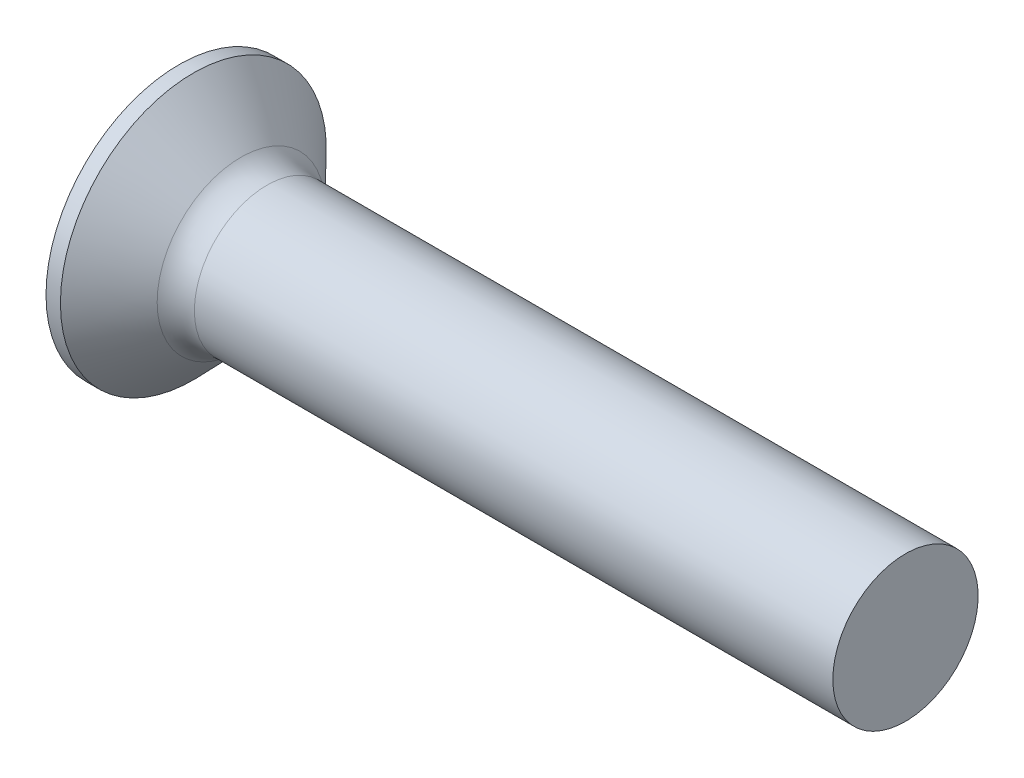
ISO-10303-21;
HEADER;
FILE_DESCRIPTION(('STEP AP214'),'2;1');
FILE_NAME('part.step','',(''),(''),'','','');
FILE_SCHEMA(('AUTOMOTIVE_DESIGN { 1 0 10303 214 1 1 1 1 }'));
ENDSEC;
DATA;
#1=APPLICATION_CONTEXT('core data for automotive mechanical design processes');
#2=APPLICATION_PROTOCOL_DEFINITION('international standard','automotive_design',2000,#1);
#3=PRODUCT_CONTEXT('',#1,'mechanical');
#4=PRODUCT('Part','Part','',(#3));
#5=PRODUCT_RELATED_PRODUCT_CATEGORY('part','',(#4));
#6=PRODUCT_DEFINITION_FORMATION('','',#4);
#7=PRODUCT_DEFINITION_CONTEXT('part definition',#1,'design');
#8=PRODUCT_DEFINITION('design','',#6,#7);
#9=PRODUCT_DEFINITION_SHAPE('','',#8);
#10=(LENGTH_UNIT() NAMED_UNIT(*) SI_UNIT(.MILLI.,.METRE.));
#11=(NAMED_UNIT(*) PLANE_ANGLE_UNIT() SI_UNIT($,.RADIAN.));
#12=(NAMED_UNIT(*) SI_UNIT($,.STERADIAN.) SOLID_ANGLE_UNIT());
#13=UNCERTAINTY_MEASURE_WITH_UNIT(LENGTH_MEASURE(1.E-05),#10,'distance_accuracy_value','');
#14=(GEOMETRIC_REPRESENTATION_CONTEXT(3) GLOBAL_UNCERTAINTY_ASSIGNED_CONTEXT((#13)) GLOBAL_UNIT_ASSIGNED_CONTEXT((#10,
#11,#12)) REPRESENTATION_CONTEXT('',''));
#15=CARTESIAN_POINT('',(0.,0.,0.));
#16=DIRECTION('',(0.,0.,1.));
#17=DIRECTION('',(1.,0.,0.));
#18=AXIS2_PLACEMENT_3D('',#15,#16,#17);
#19=CARTESIAN_POINT('',(0.,0.,0.));
#20=DIRECTION('',(-1.,0.,0.));
#21=DIRECTION('',(0.,0.,1.));
#22=AXIS2_PLACEMENT_3D('',#19,#20,#21);
#23=PLANE('',#22);
#24=CARTESIAN_POINT('',(0.,0.,0.));
#25=DIRECTION('',(-1.,0.,0.));
#26=DIRECTION('',(0.,0.,1.));
#27=AXIS2_PLACEMENT_3D('',#24,#25,#26);
#28=CIRCLE('',#27,9.15);
#29=CARTESIAN_POINT('',(0.,0.,9.15));
#30=VERTEX_POINT('',#29);
#31=EDGE_CURVE('E325',#30,#30,#28,.T.);
#32=ORIENTED_EDGE('',*,*,#31,.T.);
#33=EDGE_LOOP('',(#32));
#34=FACE_BOUND('',#33,.T.);
#35=DIRECTION('',(0.,0.,-1.));
#36=VECTOR('',#35,1.);
#37=CARTESIAN_POINT('',(0.,-1.08000000000002,4.9));
#38=LINE('',#37,#36);
#39=CARTESIAN_POINT('',(0.,-1.08000000000002,4.9));
#40=VERTEX_POINT('',#39);
#41=CARTESIAN_POINT('',(0.,-1.08000000000001,2.05881047761803));
#42=VERTEX_POINT('',#41);
#43=EDGE_CURVE('E346',#40,#42,#38,.T.);
#44=ORIENTED_EDGE('',*,*,#43,.T.);
#45=CARTESIAN_POINT('',(0.,0.,0.));
#46=DIRECTION('',(-1.,0.,0.));
#47=DIRECTION('',(0.,0.,1.));
#48=AXIS2_PLACEMENT_3D('',#45,#46,#47);
#49=CIRCLE('',#48,2.32488721936136);
#50=CARTESIAN_POINT('',(0.,-2.05881047761803,1.08));
#51=VERTEX_POINT('',#50);
#52=EDGE_CURVE('E418',#51,#42,#49,.T.);
#53=ORIENTED_EDGE('',*,*,#52,.F.);
#54=DIRECTION('',(0.,-1.,0.));
#55=VECTOR('',#54,1.);
#56=CARTESIAN_POINT('',(0.,4.9,1.08));
#57=LINE('',#56,#55);
#58=CARTESIAN_POINT('',(0.,-4.9,1.08));
#59=VERTEX_POINT('',#58);
#60=EDGE_CURVE('E297',#51,#59,#57,.T.);
#61=ORIENTED_EDGE('',*,*,#60,.T.);
#62=DIRECTION('',(0.,0.,-1.));
#63=VECTOR('',#62,1.);
#64=CARTESIAN_POINT('',(0.,-4.9,1.08));
#65=LINE('',#64,#63);
#66=CARTESIAN_POINT('',(0.,-4.9,-1.08));
#67=VERTEX_POINT('',#66);
#68=EDGE_CURVE('E280',#59,#67,#65,.T.);
#69=ORIENTED_EDGE('',*,*,#68,.T.);
#70=DIRECTION('',(0.,1.,0.));
#71=VECTOR('',#70,1.);
#72=CARTESIAN_POINT('',(0.,-4.9,-1.08));
#73=LINE('',#72,#71);
#74=CARTESIAN_POINT('',(0.,-2.05881047761803,-1.08));
#75=VERTEX_POINT('',#74);
#76=EDGE_CURVE('E289',#67,#75,#73,.T.);
#77=ORIENTED_EDGE('',*,*,#76,.T.);
#78=CARTESIAN_POINT('',(0.,-1.07999999999999,-2.05881047761803));
#79=VERTEX_POINT('',#78);
#80=EDGE_CURVE('E403',#79,#75,#49,.T.);
#81=ORIENTED_EDGE('',*,*,#80,.F.);
#82=CARTESIAN_POINT('',(0.,-1.07999999999998,-4.9));
#83=VERTEX_POINT('',#82);
#84=EDGE_CURVE('E350',#79,#83,#38,.T.);
#85=ORIENTED_EDGE('',*,*,#84,.T.);
#86=DIRECTION('',(0.,1.,0.));
#87=VECTOR('',#86,1.);
#88=CARTESIAN_POINT('',(0.,-1.07999999999998,-4.9));
#89=LINE('',#88,#87);
#90=CARTESIAN_POINT('',(0.,1.08000000000002,-4.9));
#91=VERTEX_POINT('',#90);
#92=EDGE_CURVE('E339',#83,#91,#89,.T.);
#93=ORIENTED_EDGE('',*,*,#92,.T.);
#94=DIRECTION('',(0.,0.,1.));
#95=VECTOR('',#94,1.);
#96=CARTESIAN_POINT('',(0.,1.08000000000002,-4.9));
#97=LINE('',#96,#95);
#98=CARTESIAN_POINT('',(0.,1.08000000000001,-2.05881047761803));
#99=VERTEX_POINT('',#98);
#100=EDGE_CURVE('E354',#91,#99,#97,.T.);
#101=ORIENTED_EDGE('',*,*,#100,.T.);
#102=CARTESIAN_POINT('',(0.,2.05881047761803,-1.08));
#103=VERTEX_POINT('',#102);
#104=EDGE_CURVE('E416',#103,#99,#49,.T.);
#105=ORIENTED_EDGE('',*,*,#104,.F.);
#106=CARTESIAN_POINT('',(0.,4.9,-1.08));
#107=VERTEX_POINT('',#106);
#108=EDGE_CURVE('E292',#103,#107,#73,.T.);
#109=ORIENTED_EDGE('',*,*,#108,.T.);
#110=DIRECTION('',(0.,0.,1.));
#111=VECTOR('',#110,1.);
#112=CARTESIAN_POINT('',(0.,4.9,-1.08));
#113=LINE('',#112,#111);
#114=CARTESIAN_POINT('',(0.,4.9,1.08));
#115=VERTEX_POINT('',#114);
#116=EDGE_CURVE('E291',#107,#115,#113,.T.);
#117=ORIENTED_EDGE('',*,*,#116,.T.);
#118=CARTESIAN_POINT('',(0.,2.05881047761803,1.08));
#119=VERTEX_POINT('',#118);
#120=EDGE_CURVE('E299',#115,#119,#57,.T.);
#121=ORIENTED_EDGE('',*,*,#120,.T.);
#122=CARTESIAN_POINT('',(0.,1.07999999999999,2.05881047761803));
#123=VERTEX_POINT('',#122);
#124=EDGE_CURVE('E417',#123,#119,#49,.T.);
#125=ORIENTED_EDGE('',*,*,#124,.F.);
#126=CARTESIAN_POINT('',(0.,1.07999999999998,4.9));
#127=VERTEX_POINT('',#126);
#128=EDGE_CURVE('E357',#123,#127,#97,.T.);
#129=ORIENTED_EDGE('',*,*,#128,.T.);
#130=DIRECTION('',(0.,-1.,0.));
#131=VECTOR('',#130,1.);
#132=CARTESIAN_POINT('',(0.,1.07999999999998,4.9));
#133=LINE('',#132,#131);
#134=EDGE_CURVE('E356',#127,#40,#133,.T.);
#135=ORIENTED_EDGE('',*,*,#134,.T.);
#136=EDGE_LOOP('',(#44,#53,#61,#69,#77,#81,#85,#93,#101,#105,#109,#117,#121,#125,#129,#135));
#137=FACE_BOUND('',#136,.T.);
#138=ADVANCED_FACE('F34',(#34,#137),#23,.T.);
#139=CARTESIAN_POINT('',(5.64,-2.08799982760698,1.08));
#140=DIRECTION('',(0.,0.,-1.));
#141=DIRECTION('',(0.,1.,0.));
#142=AXIS2_PLACEMENT_3D('',#139,#140,#141);
#143=PLANE('',#142);
#144=ORIENTED_EDGE('',*,*,#60,.F.);
#145=CARTESIAN_POINT('',(-3.508552371452,-2.33231165002222,1.08));
#146=CARTESIAN_POINT('',(-2.80212427855351,-2.27786290347494,1.08));
#147=CARTESIAN_POINT('',(-2.09572000083794,-2.22310096882498,1.08));
#148=CARTESIAN_POINT('',(-0.682963739884882,-2.11273813340588,1.08));
#149=CARTESIAN_POINT('',(0.0233882421280163,-2.05713721697088,1.08));
#150=CARTESIAN_POINT('',(1.08285390271521,-1.97294867301992,1.08));
#151=CARTESIAN_POINT('',(1.43599884659094,-1.94475462132179,1.08));
#152=CARTESIAN_POINT('',(2.14226366201043,-1.88806550876942,1.08));
#153=CARTESIAN_POINT('',(2.49538353361693,-1.8595704486972,1.08));
#154=CARTESIAN_POINT('',(3.2015889523463,-1.8022365024152,1.08));
#155=CARTESIAN_POINT('',(3.55467449997447,-1.77339762243347,1.08));
#156=CARTESIAN_POINT('',(4.26081605784269,-1.71532132056914,1.08));
#157=CARTESIAN_POINT('',(4.61387206778542,-1.68608389507013,1.08));
#158=CARTESIAN_POINT('',(5.41612732471709,-1.61911650604659,1.08));
#159=CARTESIAN_POINT('',(5.86531460668917,-1.58124295320442,1.08));
#160=CARTESIAN_POINT('',(6.76360881538388,-1.50456871786306,1.08));
#161=CARTESIAN_POINT('',(7.21271574234448,-1.46576803815681,1.08));
#162=CARTESIAN_POINT('',(8.11080846678724,-1.38699687421515,1.08));
#163=CARTESIAN_POINT('',(8.55979426851682,-1.34702643850978,1.08));
#164=CARTESIAN_POINT('',(9.45763439362018,-1.26556606443146,1.08));
#165=CARTESIAN_POINT('',(9.90648871523721,-1.22407610661242,1.08));
#166=CARTESIAN_POINT('',(10.804086472022,-1.13904091064148,1.08));
#167=CARTESIAN_POINT('',(11.2528298716191,-1.09549529593565,1.08));
#168=CARTESIAN_POINT('',(12.1500162616112,-1.00552937785306,1.08));
#169=CARTESIAN_POINT('',(12.5984592620319,-0.959109175798602,1.08));
#170=CARTESIAN_POINT('',(13.2708059653168,-0.8861578155995,1.08));
#171=CARTESIAN_POINT('',(13.4948891256712,-0.861284749868426,1.08));
#172=CARTESIAN_POINT('',(13.9428873803505,-0.810096676380916,1.08));
#173=CARTESIAN_POINT('',(14.1668024775431,-0.783781693824128,1.08));
#174=CARTESIAN_POINT('',(14.6144284155526,-0.729227223623336,1.08));
#175=CARTESIAN_POINT('',(14.8381392281789,-0.700987502036455,1.08));
#176=CARTESIAN_POINT('',(15.1734409779729,-0.656575769482209,1.08));
#177=CARTESIAN_POINT('',(15.2851674140663,-0.641429360520812,1.08));
#178=CARTESIAN_POINT('',(15.5085023247459,-0.610277030221325,1.08));
#179=CARTESIAN_POINT('',(15.6201107970542,-0.594271092583297,1.08));
#180=CARTESIAN_POINT('',(15.731644359719,-0.577747837441695,1.08));
#181=B_SPLINE_CURVE_WITH_KNOTS('',3,(#145,#146,#147,#148,#149,#150,#151,#152,#153,#154,#155,
#156,#157,#158,#159,#160,#161,#162,#163,#164,#165,#166,#167,#168,#169,#170,#171,#172,#173,#174,
#175,#176,#177,#178,#179,#180),.UNSPECIFIED.,.F.,.F.,(4,2,2,2,2,2,2,2,2,2,2,2,2,2,2,2,2,4),(0.,
2.12557045381571,4.25118064652266,5.31398639952898,6.37678939206669,7.4395731618212,
8.50236658170693,9.85470917308545,11.2070476910761,12.559330183477,13.9116299877686,
15.2641784740572,16.6166793133679,17.2930539423714,17.9694167544874,18.6458619223979,
18.984104295463,19.3223530851586),.UNSPECIFIED.);
#182=CARTESIAN_POINT('',(5.64,-1.60013444747621,1.08));
#183=VERTEX_POINT('',#182);
#184=EDGE_CURVE('E394',#51,#183,#181,.T.);
#185=ORIENTED_EDGE('',*,*,#184,.T.);
#186=DIRECTION('',(0.,-1.,0.));
#187=VECTOR('',#186,1.);
#188=CARTESIAN_POINT('',(5.64,2.08799982760698,1.08));
#189=LINE('',#188,#187);
#190=CARTESIAN_POINT('',(5.64,-2.08799982760698,1.08));
#191=VERTEX_POINT('',#190);
#192=EDGE_CURVE('E315',#183,#191,#189,.T.);
#193=ORIENTED_EDGE('',*,*,#192,.T.);
#194=DIRECTION('',(0.89493436774996,0.446197800778958,0.));
#195=VECTOR('',#194,1.);
#196=CARTESIAN_POINT('',(0.,-4.9,1.08));
#197=LINE('',#196,#195);
#198=EDGE_CURVE('E286',#59,#191,#197,.T.);
#199=ORIENTED_EDGE('',*,*,#198,.F.);
#200=EDGE_LOOP('',(#144,#185,#193,#199));
#201=FACE_BOUND('',#200,.T.);
#202=ADVANCED_FACE('F166',(#201),#143,.T.);
#203=CARTESIAN_POINT('',(5.64,2.08799982760699,1.08));
#204=VERTEX_POINT('',#203);
#205=CARTESIAN_POINT('',(5.64,1.60013444747621,1.08));
#206=VERTEX_POINT('',#205);
#207=EDGE_CURVE('E317',#204,#206,#189,.T.);
#208=ORIENTED_EDGE('',*,*,#207,.T.);
#209=CARTESIAN_POINT('',(-3.508552371452,2.33231165002222,1.08));
#210=CARTESIAN_POINT('',(-2.8021242785535,2.27786290347494,1.08));
#211=CARTESIAN_POINT('',(-2.09572000083793,2.22310096882498,1.08));
#212=CARTESIAN_POINT('',(-0.682963739884882,2.11273813340588,1.08));
#213=CARTESIAN_POINT('',(0.0233882421280164,2.05713721697088,1.08));
#214=CARTESIAN_POINT('',(1.08285390271521,1.97294867301993,1.08));
#215=CARTESIAN_POINT('',(1.43599884659094,1.94475462132179,1.08));
#216=CARTESIAN_POINT('',(2.14226366201043,1.88806550876942,1.08));
#217=CARTESIAN_POINT('',(2.49538353361693,1.8595704486972,1.08));
#218=CARTESIAN_POINT('',(3.2015889523463,1.8022365024152,1.08));
#219=CARTESIAN_POINT('',(3.55467449997447,1.77339762243347,1.08));
#220=CARTESIAN_POINT('',(4.26081605784269,1.71532132056914,1.08));
#221=CARTESIAN_POINT('',(4.61387206778542,1.68608389507013,1.08));
#222=CARTESIAN_POINT('',(5.41612732471709,1.61911650604659,1.08));
#223=CARTESIAN_POINT('',(5.86531460668916,1.58124295320442,1.08));
#224=CARTESIAN_POINT('',(6.76360881538388,1.50456871786306,1.08));
#225=CARTESIAN_POINT('',(7.21271574234448,1.46576803815681,1.08));
#226=CARTESIAN_POINT('',(8.11080846678724,1.38699687421515,1.08));
#227=CARTESIAN_POINT('',(8.55979426851681,1.34702643850978,1.08));
#228=CARTESIAN_POINT('',(9.45763439362018,1.26556606443146,1.08));
#229=CARTESIAN_POINT('',(9.90648871523721,1.22407610661242,1.08));
#230=CARTESIAN_POINT('',(10.804086472022,1.13904091064148,1.08));
#231=CARTESIAN_POINT('',(11.2528298716191,1.09549529593565,1.08));
#232=CARTESIAN_POINT('',(12.1500162616112,1.00552937785306,1.08));
#233=CARTESIAN_POINT('',(12.5984592620319,0.959109175798603,1.08));
#234=CARTESIAN_POINT('',(13.2708059653168,0.886157815599501,1.08));
#235=CARTESIAN_POINT('',(13.4948891256712,0.861284749868425,1.08));
#236=CARTESIAN_POINT('',(13.9428873803505,0.810096676380916,1.08));
#237=CARTESIAN_POINT('',(14.1668024775431,0.783781693824127,1.08));
#238=CARTESIAN_POINT('',(14.6144284155526,0.729227223623335,1.08));
#239=CARTESIAN_POINT('',(14.8381392281789,0.700987502036455,1.08));
#240=CARTESIAN_POINT('',(15.1734409779729,0.656575769482208,1.08));
#241=CARTESIAN_POINT('',(15.2851674140663,0.641429360520811,1.08));
#242=CARTESIAN_POINT('',(15.5085023247459,0.610277030221324,1.08));
#243=CARTESIAN_POINT('',(15.6201107970543,0.594271092583296,1.08));
#244=CARTESIAN_POINT('',(15.731644359719,0.577747837441694,1.08));
#245=B_SPLINE_CURVE_WITH_KNOTS('',3,(#209,#210,#211,#212,#213,#214,#215,#216,#217,#218,#219,
#220,#221,#222,#223,#224,#225,#226,#227,#228,#229,#230,#231,#232,#233,#234,#235,#236,#237,#238,
#239,#240,#241,#242,#243,#244),.UNSPECIFIED.,.F.,.F.,(4,2,2,2,2,2,2,2,2,2,2,2,2,2,2,2,2,4),(0.,
2.12557045381571,4.25118064652265,5.31398639952898,6.37678939206668,7.43957316182119,
8.50236658170693,9.85470917308544,11.2070476910761,12.559330183477,13.9116299877686,
15.2641784740572,16.6166793133679,17.2930539423714,17.9694167544874,18.6458619223979,
18.984104295463,19.3223530851586),.UNSPECIFIED.);
#246=EDGE_CURVE('E226',#206,#119,#245,.F.);
#247=ORIENTED_EDGE('',*,*,#246,.T.);
#248=ORIENTED_EDGE('',*,*,#120,.F.);
#249=DIRECTION('',(0.89493436774996,-0.446197800778958,0.));
#250=VECTOR('',#249,1.);
#251=CARTESIAN_POINT('',(0.,4.9,1.08));
#252=LINE('',#251,#250);
#253=EDGE_CURVE('E62',#115,#204,#252,.T.);
#254=ORIENTED_EDGE('',*,*,#253,.T.);
#255=EDGE_LOOP('',(#208,#247,#248,#254));
#256=FACE_BOUND('',#255,.T.);
#257=ADVANCED_FACE('F171',(#256),#143,.T.);
#258=CARTESIAN_POINT('',(5.64,2.08799982760699,-1.08));
#259=DIRECTION('',(0.,0.,1.));
#260=DIRECTION('',(1.,0.,0.));
#261=AXIS2_PLACEMENT_3D('',#258,#259,#260);
#262=PLANE('',#261);
#263=DIRECTION('',(0.,1.,0.));
#264=VECTOR('',#263,1.);
#265=CARTESIAN_POINT('',(5.64,-2.08799982760699,-1.08));
#266=LINE('',#265,#264);
#267=CARTESIAN_POINT('',(5.64,-2.08799982760699,-1.08));
#268=VERTEX_POINT('',#267);
#269=CARTESIAN_POINT('',(5.64,-1.60013444747621,-1.08));
#270=VERTEX_POINT('',#269);
#271=EDGE_CURVE('E316',#268,#270,#266,.T.);
#272=ORIENTED_EDGE('',*,*,#271,.T.);
#273=CARTESIAN_POINT('',(-3.50855235785895,-2.33231164897474,-1.08));
#274=CARTESIAN_POINT('',(-2.80212426669874,-2.27786290255719,-1.08));
#275=CARTESIAN_POINT('',(-2.09571999072138,-2.22310096803798,-1.08));
#276=CARTESIAN_POINT('',(-0.682963733244686,-2.11273813288378,-1.08));
#277=CARTESIAN_POINT('',(0.0233882470300694,-2.05713721658294,-1.08));
#278=CARTESIAN_POINT('',(1.0828539044558,-1.97294867288082,-1.08));
#279=CARTESIAN_POINT('',(1.43599884690811,-1.94475462129601,-1.08));
#280=CARTESIAN_POINT('',(2.14226365948097,-1.88806550897276,-1.08));
#281=CARTESIAN_POINT('',(2.49538352966426,-1.85957044901634,-1.08));
#282=CARTESIAN_POINT('',(3.20158894554756,-1.80223650296893,-1.08));
#283=CARTESIAN_POINT('',(3.55467449175288,-1.773397623106,-1.08));
#284=CARTESIAN_POINT('',(4.26081604677565,-1.715321321483,-1.08));
#285=CARTESIAN_POINT('',(4.61387205529579,-1.68608389610653,-1.08));
#286=CARTESIAN_POINT('',(5.41612731080518,-1.61911650721572,-1.08));
#287=CARTESIAN_POINT('',(5.86531459277744,-1.58124295438217,-1.08));
#288=CARTESIAN_POINT('',(6.76360880147276,-1.50456871906015,-1.08));
#289=CARTESIAN_POINT('',(7.21271572843377,-1.46576803936464,-1.08));
#290=CARTESIAN_POINT('',(8.11080845287784,-1.38699687544741,-1.08));
#291=CARTESIAN_POINT('',(8.55979425460832,-1.34702643975574,-1.08));
#292=CARTESIAN_POINT('',(9.45763437971387,-1.26556606570916,-1.08));
#293=CARTESIAN_POINT('',(9.90648870133217,-1.22407610790816,-1.08));
#294=CARTESIAN_POINT('',(10.8040864581195,-1.13904091198014,-1.08));
#295=CARTESIAN_POINT('',(11.2528298577178,-1.09549529729918,-1.08));
#296=CARTESIAN_POINT('',(12.1500162477138,-1.00552937927742,-1.08));
#297=CARTESIAN_POINT('',(12.5984592481373,-0.959109177258918,-1.08));
#298=CARTESIAN_POINT('',(13.2708059514278,-0.886157817129851,-1.08));
#299=CARTESIAN_POINT('',(13.4948891117843,-0.861284751424836,-1.08));
#300=CARTESIAN_POINT('',(13.9428873664685,-0.810096677997513,-1.08));
#301=CARTESIAN_POINT('',(14.1668024636642,-0.783781695474851,-1.08));
#302=CARTESIAN_POINT('',(14.6144284016815,-0.729227225354873,-1.08));
#303=CARTESIAN_POINT('',(14.8381392143124,-0.700987503814685,-1.08));
#304=CARTESIAN_POINT('',(15.1734409641157,-0.65657577134678,-1.08));
#305=CARTESIAN_POINT('',(15.2851674002126,-0.64142936241689,-1.08));
#306=CARTESIAN_POINT('',(15.5085023109007,-0.610277032188298,-1.08));
#307=CARTESIAN_POINT('',(15.6201107832138,-0.594271094589659,-1.08));
#308=CARTESIAN_POINT('',(15.7316443458843,-0.577747839492605,-1.08));
#309=B_SPLINE_CURVE_WITH_KNOTS('',3,(#273,#274,#275,#276,#277,#278,#279,#280,#281,#282,#283,
#284,#285,#286,#287,#288,#289,#290,#291,#292,#293,#294,#295,#296,#297,#298,#299,#300,#301,#302,
#303,#304,#305,#306,#307,#308),.UNSPECIFIED.,.F.,.F.,(4,2,2,2,2,2,2,2,2,2,2,2,2,2,2,2,2,4),(0.,
2.12557044858637,4.25118063606338,5.31398638478592,6.3767893730399,7.439573138511,
8.50236655411318,9.85470914549009,11.2070476634792,12.5593301558792,13.9116299601696,
15.2641784464547,16.6166792857626,17.2930539147632,17.9694167268767,18.6458618947835,
18.9841042678463,19.3223530575396),.UNSPECIFIED.);
#310=EDGE_CURVE('E220',#270,#75,#309,.F.);
#311=ORIENTED_EDGE('',*,*,#310,.T.);
#312=ORIENTED_EDGE('',*,*,#76,.F.);
#313=DIRECTION('',(0.89493436774996,0.446197800778958,0.));
#314=VECTOR('',#313,1.);
#315=CARTESIAN_POINT('',(0.,-4.9,-1.08));
#316=LINE('',#315,#314);
#317=EDGE_CURVE('E276',#67,#268,#316,.T.);
#318=ORIENTED_EDGE('',*,*,#317,.T.);
#319=EDGE_LOOP('',(#272,#311,#312,#318));
#320=FACE_BOUND('',#319,.T.);
#321=ADVANCED_FACE('F206',(#320),#262,.T.);
#322=ORIENTED_EDGE('',*,*,#108,.F.);
#323=CARTESIAN_POINT('',(-3.50855235785895,2.33231164897474,-1.08));
#324=CARTESIAN_POINT('',(-2.80212426669874,2.27786290255719,-1.08));
#325=CARTESIAN_POINT('',(-2.09571999072138,2.22310096803798,-1.08));
#326=CARTESIAN_POINT('',(-0.682963733244686,2.11273813288378,-1.08));
#327=CARTESIAN_POINT('',(0.0233882470300688,2.05713721658294,-1.08));
#328=CARTESIAN_POINT('',(1.0828539044558,1.97294867288082,-1.08));
#329=CARTESIAN_POINT('',(1.43599884690811,1.94475462129601,-1.08));
#330=CARTESIAN_POINT('',(2.14226365948097,1.88806550897276,-1.08));
#331=CARTESIAN_POINT('',(2.49538352966426,1.85957044901634,-1.08));
#332=CARTESIAN_POINT('',(3.20158894554756,1.80223650296893,-1.08));
#333=CARTESIAN_POINT('',(3.55467449175288,1.773397623106,-1.08));
#334=CARTESIAN_POINT('',(4.26081604677565,1.715321321483,-1.08));
#335=CARTESIAN_POINT('',(4.61387205529579,1.68608389610653,-1.08));
#336=CARTESIAN_POINT('',(5.41612731080518,1.61911650721572,-1.08));
#337=CARTESIAN_POINT('',(5.86531459277744,1.58124295438217,-1.08));
#338=CARTESIAN_POINT('',(6.76360880147275,1.50456871906015,-1.08));
#339=CARTESIAN_POINT('',(7.21271572843377,1.46576803936464,-1.08));
#340=CARTESIAN_POINT('',(8.11080845287784,1.38699687544741,-1.08));
#341=CARTESIAN_POINT('',(8.55979425460832,1.34702643975574,-1.08));
#342=CARTESIAN_POINT('',(9.45763437971387,1.26556606570916,-1.08));
#343=CARTESIAN_POINT('',(9.90648870133217,1.22407610790816,-1.08));
#344=CARTESIAN_POINT('',(10.8040864581195,1.13904091198014,-1.08));
#345=CARTESIAN_POINT('',(11.2528298577178,1.09549529729918,-1.08));
#346=CARTESIAN_POINT('',(12.1500162477138,1.00552937927742,-1.08));
#347=CARTESIAN_POINT('',(12.5984592481373,0.959109177258918,-1.08));
#348=CARTESIAN_POINT('',(13.2708059514278,0.886157817129851,-1.08));
#349=CARTESIAN_POINT('',(13.4948891117843,0.861284751424836,-1.08));
#350=CARTESIAN_POINT('',(13.9428873664685,0.810096677997514,-1.08));
#351=CARTESIAN_POINT('',(14.1668024636642,0.783781695474852,-1.08));
#352=CARTESIAN_POINT('',(14.6144284016814,0.729227225354874,-1.08));
#353=CARTESIAN_POINT('',(14.8381392143124,0.700987503814685,-1.08));
#354=CARTESIAN_POINT('',(15.1734409641157,0.656575771346781,-1.08));
#355=CARTESIAN_POINT('',(15.2851674002126,0.641429362416891,-1.08));
#356=CARTESIAN_POINT('',(15.5085023109006,0.610277032188299,-1.08));
#357=CARTESIAN_POINT('',(15.6201107832138,0.59427109458966,-1.08));
#358=CARTESIAN_POINT('',(15.7316443458843,0.577747839492606,-1.08));
#359=B_SPLINE_CURVE_WITH_KNOTS('',3,(#323,#324,#325,#326,#327,#328,#329,#330,#331,#332,#333,
#334,#335,#336,#337,#338,#339,#340,#341,#342,#343,#344,#345,#346,#347,#348,#349,#350,#351,#352,
#353,#354,#355,#356,#357,#358),.UNSPECIFIED.,.F.,.F.,(4,2,2,2,2,2,2,2,2,2,2,2,2,2,2,2,2,4),(0.,
2.12557044858637,4.25118063606338,5.31398638478592,6.3767893730399,7.439573138511,
8.50236655411318,9.85470914549009,11.2070476634792,12.5593301558792,13.9116299601696,
15.2641784464547,16.6166792857626,17.2930539147632,17.9694167268767,18.6458618947834,
18.9841042678463,19.3223530575396),.UNSPECIFIED.);
#360=CARTESIAN_POINT('',(5.64,1.60013444747621,-1.08));
#361=VERTEX_POINT('',#360);
#362=EDGE_CURVE('E214',#103,#361,#359,.T.);
#363=ORIENTED_EDGE('',*,*,#362,.T.);
#364=CARTESIAN_POINT('',(5.64,2.08799982760698,-1.08));
#365=VERTEX_POINT('',#364);
#366=EDGE_CURVE('E321',#361,#365,#266,.T.);
#367=ORIENTED_EDGE('',*,*,#366,.T.);
#368=DIRECTION('',(0.89493436774996,-0.446197800778958,0.));
#369=VECTOR('',#368,1.);
#370=CARTESIAN_POINT('',(0.,4.9,-1.08));
#371=LINE('',#370,#369);
#372=EDGE_CURVE('E310',#107,#365,#371,.T.);
#373=ORIENTED_EDGE('',*,*,#372,.F.);
#374=EDGE_LOOP('',(#322,#363,#367,#373));
#375=FACE_BOUND('',#374,.T.);
#376=ADVANCED_FACE('F198',(#375),#262,.T.);
#377=CARTESIAN_POINT('',(5.64,2.08799982760698,-1.08));
#378=DIRECTION('',(1.,0.,0.));
#379=DIRECTION('',(0.,0.,-1.));
#380=AXIS2_PLACEMENT_3D('',#377,#378,#379);
#381=PLANE('',#380);
#382=CARTESIAN_POINT('',(5.64,0.,0.));
#383=DIRECTION('',(-1.,0.,0.));
#384=DIRECTION('',(0.,0.,1.));
#385=AXIS2_PLACEMENT_3D('',#382,#383,#384);
#386=CIRCLE('',#385,1.9305);
#387=EDGE_CURVE('E425',#270,#183,#386,.T.);
#388=ORIENTED_EDGE('',*,*,#387,.F.);
#389=ORIENTED_EDGE('',*,*,#271,.F.);
#390=DIRECTION('',(0.,0.,-1.));
#391=VECTOR('',#390,1.);
#392=CARTESIAN_POINT('',(5.64,-2.08799982760698,1.08));
#393=LINE('',#392,#391);
#394=EDGE_CURVE('E283',#191,#268,#393,.T.);
#395=ORIENTED_EDGE('',*,*,#394,.F.);
#396=ORIENTED_EDGE('',*,*,#192,.F.);
#397=EDGE_LOOP('',(#388,#389,#395,#396));
#398=FACE_BOUND('',#397,.T.);
#399=ADVANCED_FACE('F194',(#398),#381,.F.);
#400=CARTESIAN_POINT('',(5.64,-1.08000000000001,1.60013444747621));
#401=VERTEX_POINT('',#400);
#402=CARTESIAN_POINT('',(5.64,1.07999999999999,1.60013444747622));
#403=VERTEX_POINT('',#402);
#404=EDGE_CURVE('E420',#401,#403,#386,.T.);
#405=ORIENTED_EDGE('',*,*,#404,.F.);
#406=DIRECTION('',(0.,0.,-1.));
#407=VECTOR('',#406,1.);
#408=CARTESIAN_POINT('',(5.64,-1.08000000000001,2.08799982760698));
#409=LINE('',#408,#407);
#410=CARTESIAN_POINT('',(5.64,-1.08000000000001,2.08799982760698));
#411=VERTEX_POINT('',#410);
#412=EDGE_CURVE('E375',#411,#401,#409,.T.);
#413=ORIENTED_EDGE('',*,*,#412,.F.);
#414=DIRECTION('',(0.,-1.,0.));
#415=VECTOR('',#414,1.);
#416=CARTESIAN_POINT('',(5.64,1.07999999999999,2.08799982760699));
#417=LINE('',#416,#415);
#418=CARTESIAN_POINT('',(5.64,1.07999999999999,2.08799982760699));
#419=VERTEX_POINT('',#418);
#420=EDGE_CURVE('E370',#419,#411,#417,.T.);
#421=ORIENTED_EDGE('',*,*,#420,.F.);
#422=DIRECTION('',(0.,0.,1.));
#423=VECTOR('',#422,1.);
#424=CARTESIAN_POINT('',(5.64,1.08000000000001,-2.08799982760698));
#425=LINE('',#424,#423);
#426=EDGE_CURVE('E380',#403,#419,#425,.T.);
#427=ORIENTED_EDGE('',*,*,#426,.F.);
#428=EDGE_LOOP('',(#405,#413,#421,#427));
#429=FACE_BOUND('',#428,.T.);
#430=ADVANCED_FACE('F197',(#429),#381,.F.);
#431=EDGE_CURVE('E391',#206,#361,#386,.T.);
#432=ORIENTED_EDGE('',*,*,#431,.F.);
#433=ORIENTED_EDGE('',*,*,#207,.F.);
#434=DIRECTION('',(0.,0.,1.));
#435=VECTOR('',#434,1.);
#436=CARTESIAN_POINT('',(5.64,2.08799982760698,-1.08));
#437=LINE('',#436,#435);
#438=EDGE_CURVE('E313',#365,#204,#437,.T.);
#439=ORIENTED_EDGE('',*,*,#438,.F.);
#440=ORIENTED_EDGE('',*,*,#366,.F.);
#441=EDGE_LOOP('',(#432,#433,#439,#440));
#442=FACE_BOUND('',#441,.T.);
#443=ADVANCED_FACE('F388',(#442),#381,.F.);
#444=CARTESIAN_POINT('',(5.64,1.08000000000001,-1.60013444747621));
#445=VERTEX_POINT('',#444);
#446=CARTESIAN_POINT('',(5.64,-1.07999999999999,-1.60013444747621));
#447=VERTEX_POINT('',#446);
#448=EDGE_CURVE('E415',#445,#447,#386,.T.);
#449=ORIENTED_EDGE('',*,*,#448,.F.);
#450=CARTESIAN_POINT('',(5.64,1.08000000000001,-2.08799982760698));
#451=VERTEX_POINT('',#450);
#452=EDGE_CURVE('E374',#451,#445,#425,.T.);
#453=ORIENTED_EDGE('',*,*,#452,.F.);
#454=DIRECTION('',(0.,1.,0.));
#455=VECTOR('',#454,1.);
#456=CARTESIAN_POINT('',(5.64,-1.07999999999999,-2.08799982760699));
#457=LINE('',#456,#455);
#458=CARTESIAN_POINT('',(5.64,-1.07999999999999,-2.08799982760699));
#459=VERTEX_POINT('',#458);
#460=EDGE_CURVE('E369',#459,#451,#457,.T.);
#461=ORIENTED_EDGE('',*,*,#460,.F.);
#462=EDGE_CURVE('E373',#447,#459,#409,.T.);
#463=ORIENTED_EDGE('',*,*,#462,.F.);
#464=EDGE_LOOP('',(#449,#453,#461,#463));
#465=FACE_BOUND('',#464,.T.);
#466=ADVANCED_FACE('F200',(#465),#381,.F.);
#467=CARTESIAN_POINT('',(5.64,1.07999999999999,2.08799982760699));
#468=DIRECTION('',(0.,-1.,0.));
#469=DIRECTION('',(1.,0.,0.));
#470=AXIS2_PLACEMENT_3D('',#467,#468,#469);
#471=PLANE('',#470);
#472=ORIENTED_EDGE('',*,*,#452,.T.);
#473=CARTESIAN_POINT('',(-3.508552371452,1.08000000000001,-2.33231165002222));
#474=CARTESIAN_POINT('',(-2.8021242785535,1.08000000000001,-2.27786290347493));
#475=CARTESIAN_POINT('',(-2.09572000083794,1.08000000000001,-2.22310096882497));
#476=CARTESIAN_POINT('',(-0.682963739884883,1.08000000000001,-2.11273813340588));
#477=CARTESIAN_POINT('',(0.023388242128016,1.08000000000001,-2.05713721697088));
#478=CARTESIAN_POINT('',(1.08285390271521,1.08000000000001,-1.97294867301992));
#479=CARTESIAN_POINT('',(1.43599884659094,1.08000000000001,-1.94475462132178));
#480=CARTESIAN_POINT('',(2.14226366201044,1.08000000000001,-1.88806550876941));
#481=CARTESIAN_POINT('',(2.49538353361694,1.08000000000001,-1.8595704486972));
#482=CARTESIAN_POINT('',(3.2015889523463,1.08000000000001,-1.8022365024152));
#483=CARTESIAN_POINT('',(3.55467449997447,1.08000000000001,-1.77339762243347));
#484=CARTESIAN_POINT('',(4.26081605784269,1.08000000000001,-1.71532132056914));
#485=CARTESIAN_POINT('',(4.61387206778542,1.08000000000001,-1.68608389507012));
#486=CARTESIAN_POINT('',(5.41612732471709,1.08000000000001,-1.61911650604659));
#487=CARTESIAN_POINT('',(5.86531460668917,1.08000000000001,-1.58124295320442));
#488=CARTESIAN_POINT('',(6.76360881538388,1.08,-1.50456871786305));
#489=CARTESIAN_POINT('',(7.21271574234448,1.08,-1.46576803815681));
#490=CARTESIAN_POINT('',(8.11080846678724,1.08,-1.38699687421514));
#491=CARTESIAN_POINT('',(8.55979426851682,1.08,-1.34702643850977));
#492=CARTESIAN_POINT('',(9.45763439362018,1.08,-1.26556606443146));
#493=CARTESIAN_POINT('',(9.90648871523721,1.08,-1.22407610661242));
#494=CARTESIAN_POINT('',(10.804086472022,1.08,-1.13904091064148));
#495=CARTESIAN_POINT('',(11.2528298716191,1.08,-1.09549529593564));
#496=CARTESIAN_POINT('',(12.1500162616112,1.08,-1.00552937785305));
#497=CARTESIAN_POINT('',(12.5984592620319,1.08,-0.959109175798599));
#498=CARTESIAN_POINT('',(13.2708059653168,1.08,-0.886157815599496));
#499=CARTESIAN_POINT('',(13.4948891256712,1.08,-0.861284749868422));
#500=CARTESIAN_POINT('',(13.9428873803505,1.08,-0.810096676380912));
#501=CARTESIAN_POINT('',(14.1668024775431,1.08,-0.783781693824124));
#502=CARTESIAN_POINT('',(14.6144284155526,1.08,-0.729227223623332));
#503=CARTESIAN_POINT('',(14.8381392281789,1.08,-0.700987502036451));
#504=CARTESIAN_POINT('',(15.1734409779729,1.08,-0.656575769482205));
#505=CARTESIAN_POINT('',(15.2851674140663,1.08,-0.641429360520808));
#506=CARTESIAN_POINT('',(15.5085023247459,1.08,-0.61027703022132));
#507=CARTESIAN_POINT('',(15.6201107970542,1.08,-0.594271092583292));
#508=CARTESIAN_POINT('',(15.731644359719,1.08,-0.577747837441691));
#509=B_SPLINE_CURVE_WITH_KNOTS('',3,(#473,#474,#475,#476,#477,#478,#479,#480,#481,#482,#483,
#484,#485,#486,#487,#488,#489,#490,#491,#492,#493,#494,#495,#496,#497,#498,#499,#500,#501,#502,
#503,#504,#505,#506,#507,#508),.UNSPECIFIED.,.F.,.F.,(4,2,2,2,2,2,2,2,2,2,2,2,2,2,2,2,2,4),(0.,
2.12557045381571,4.25118064652266,5.31398639952898,6.37678939206669,7.4395731618212,
8.50236658170693,9.85470917308545,11.2070476910761,12.559330183477,13.9116299877686,
15.2641784740572,16.6166793133679,17.2930539423714,17.9694167544874,18.6458619223979,
18.984104295463,19.3223530851586),.UNSPECIFIED.);
#510=EDGE_CURVE('E251',#445,#99,#509,.F.);
#511=ORIENTED_EDGE('',*,*,#510,.T.);
#512=ORIENTED_EDGE('',*,*,#100,.F.);
#513=DIRECTION('',(0.89493436774996,0.,0.446197800778958));
#514=VECTOR('',#513,1.);
#515=CARTESIAN_POINT('',(0.,1.08000000000002,-4.9));
#516=LINE('',#515,#514);
#517=EDGE_CURVE('E361',#91,#451,#516,.T.);
#518=ORIENTED_EDGE('',*,*,#517,.T.);
#519=EDGE_LOOP('',(#472,#511,#512,#518));
#520=FACE_BOUND('',#519,.T.);
#521=ADVANCED_FACE('F257',(#520),#471,.T.);
#522=CARTESIAN_POINT('',(5.64,-1.07999999999999,-2.08799982760699));
#523=DIRECTION('',(0.,1.,0.));
#524=DIRECTION('',(0.,0.,1.));
#525=AXIS2_PLACEMENT_3D('',#522,#523,#524);
#526=PLANE('',#525);
#527=ORIENTED_EDGE('',*,*,#84,.F.);
#528=CARTESIAN_POINT('',(-3.508552371452,-1.07999999999999,-2.33231165002223));
#529=CARTESIAN_POINT('',(-2.8021242785535,-1.07999999999999,-2.27786290347494));
#530=CARTESIAN_POINT('',(-2.09572000083793,-1.07999999999999,-2.22310096882498));
#531=CARTESIAN_POINT('',(-0.682963739884882,-1.07999999999999,-2.11273813340588));
#532=CARTESIAN_POINT('',(0.0233882421280161,-1.07999999999999,-2.05713721697089));
#533=CARTESIAN_POINT('',(1.08285390271521,-1.07999999999999,-1.97294867301993));
#534=CARTESIAN_POINT('',(1.43599884659094,-1.07999999999999,-1.94475462132179));
#535=CARTESIAN_POINT('',(2.14226366201043,-1.07999999999999,-1.88806550876942));
#536=CARTESIAN_POINT('',(2.49538353361693,-1.07999999999999,-1.85957044869721));
#537=CARTESIAN_POINT('',(3.2015889523463,-1.07999999999999,-1.80223650241521));
#538=CARTESIAN_POINT('',(3.55467449997447,-1.07999999999999,-1.77339762243348));
#539=CARTESIAN_POINT('',(4.26081605784269,-1.07999999999999,-1.71532132056914));
#540=CARTESIAN_POINT('',(4.61387206778542,-1.07999999999999,-1.68608389507013));
#541=CARTESIAN_POINT('',(5.41612732471709,-1.07999999999999,-1.6191165060466));
#542=CARTESIAN_POINT('',(5.86531460668916,-1.07999999999999,-1.58124295320443));
#543=CARTESIAN_POINT('',(6.76360881538388,-1.07999999999999,-1.50456871786306));
#544=CARTESIAN_POINT('',(7.21271574234448,-1.07999999999999,-1.46576803815681));
#545=CARTESIAN_POINT('',(8.11080846678724,-1.08,-1.38699687421515));
#546=CARTESIAN_POINT('',(8.55979426851681,-1.08,-1.34702643850978));
#547=CARTESIAN_POINT('',(9.45763439362018,-1.08,-1.26556606443146));
#548=CARTESIAN_POINT('',(9.90648871523721,-1.08,-1.22407610661242));
#549=CARTESIAN_POINT('',(10.804086472022,-1.08,-1.13904091064149));
#550=CARTESIAN_POINT('',(11.2528298716191,-1.08,-1.09549529593565));
#551=CARTESIAN_POINT('',(12.1500162616112,-1.08,-1.00552937785306));
#552=CARTESIAN_POINT('',(12.5984592620319,-1.08,-0.959109175798606));
#553=CARTESIAN_POINT('',(13.2708059653168,-1.08,-0.886157815599504));
#554=CARTESIAN_POINT('',(13.4948891256712,-1.08,-0.861284749868429));
#555=CARTESIAN_POINT('',(13.9428873803505,-1.08,-0.81009667638092));
#556=CARTESIAN_POINT('',(14.1668024775431,-1.08,-0.783781693824131));
#557=CARTESIAN_POINT('',(14.6144284155526,-1.08,-0.729227223623339));
#558=CARTESIAN_POINT('',(14.8381392281789,-1.08,-0.700987502036459));
#559=CARTESIAN_POINT('',(15.1734409779729,-1.08,-0.656575769482213));
#560=CARTESIAN_POINT('',(15.2851674140663,-1.08,-0.641429360520816));
#561=CARTESIAN_POINT('',(15.5085023247459,-1.08,-0.610277030221329));
#562=CARTESIAN_POINT('',(15.6201107970542,-1.08,-0.594271092583301));
#563=CARTESIAN_POINT('',(15.731644359719,-1.08,-0.577747837441699));
#564=B_SPLINE_CURVE_WITH_KNOTS('',3,(#528,#529,#530,#531,#532,#533,#534,#535,#536,#537,#538,
#539,#540,#541,#542,#543,#544,#545,#546,#547,#548,#549,#550,#551,#552,#553,#554,#555,#556,#557,
#558,#559,#560,#561,#562,#563),.UNSPECIFIED.,.F.,.F.,(4,2,2,2,2,2,2,2,2,2,2,2,2,2,2,2,2,4),(0.,
2.12557045381571,4.25118064652266,5.31398639952898,6.37678939206669,7.43957316182119,
8.50236658170693,9.85470917308544,11.2070476910761,12.559330183477,13.9116299877686,
15.2641784740572,16.6166793133679,17.2930539423714,17.9694167544874,18.6458619223979,
18.984104295463,19.3223530851586),.UNSPECIFIED.);
#565=EDGE_CURVE('E246',#79,#447,#564,.T.);
#566=ORIENTED_EDGE('',*,*,#565,.T.);
#567=ORIENTED_EDGE('',*,*,#462,.T.);
#568=DIRECTION('',(0.89493436774996,0.,0.446197800778958));
#569=VECTOR('',#568,1.);
#570=CARTESIAN_POINT('',(0.,-1.07999999999998,-4.9));
#571=LINE('',#570,#569);
#572=EDGE_CURVE('E358',#83,#459,#571,.T.);
#573=ORIENTED_EDGE('',*,*,#572,.F.);
#574=EDGE_LOOP('',(#527,#566,#567,#573));
#575=FACE_BOUND('',#574,.T.);
#576=ADVANCED_FACE('F261',(#575),#526,.T.);
#577=ORIENTED_EDGE('',*,*,#412,.T.);
#578=CARTESIAN_POINT('',(-3.50855235785895,-1.08000000000001,2.33231164897474));
#579=CARTESIAN_POINT('',(-2.80212426669874,-1.08000000000001,2.27786290255719));
#580=CARTESIAN_POINT('',(-2.09571999072138,-1.08000000000001,2.22310096803797));
#581=CARTESIAN_POINT('',(-0.682963733244687,-1.08000000000001,2.11273813288378));
#582=CARTESIAN_POINT('',(0.0233882470300683,-1.08000000000001,2.05713721658293));
#583=CARTESIAN_POINT('',(1.0828539044558,-1.08000000000001,1.97294867288082));
#584=CARTESIAN_POINT('',(1.43599884690811,-1.08000000000001,1.94475462129601));
#585=CARTESIAN_POINT('',(2.14226365948097,-1.08000000000001,1.88806550897276));
#586=CARTESIAN_POINT('',(2.49538352966426,-1.08000000000001,1.85957044901634));
#587=CARTESIAN_POINT('',(3.20158894554756,-1.08000000000001,1.80223650296892));
#588=CARTESIAN_POINT('',(3.55467449175288,-1.08000000000001,1.77339762310599));
#589=CARTESIAN_POINT('',(4.26081604677565,-1.08000000000001,1.715321321483));
#590=CARTESIAN_POINT('',(4.61387205529579,-1.08000000000001,1.68608389610653));
#591=CARTESIAN_POINT('',(5.41612731080518,-1.08000000000001,1.61911650721572));
#592=CARTESIAN_POINT('',(5.86531459277744,-1.08000000000001,1.58124295438216));
#593=CARTESIAN_POINT('',(6.76360880147275,-1.08,1.50456871906015));
#594=CARTESIAN_POINT('',(7.21271572843377,-1.08,1.46576803936464));
#595=CARTESIAN_POINT('',(8.11080845287784,-1.08,1.38699687544741));
#596=CARTESIAN_POINT('',(8.55979425460832,-1.08,1.34702643975574));
#597=CARTESIAN_POINT('',(9.45763437971387,-1.08,1.26556606570916));
#598=CARTESIAN_POINT('',(9.90648870133217,-1.08,1.22407610790816));
#599=CARTESIAN_POINT('',(10.8040864581195,-1.08,1.13904091198014));
#600=CARTESIAN_POINT('',(11.2528298577178,-1.08,1.09549529729918));
#601=CARTESIAN_POINT('',(12.1500162477138,-1.08,1.00552937927742));
#602=CARTESIAN_POINT('',(12.5984592481373,-1.08,0.959109177258916));
#603=CARTESIAN_POINT('',(13.2708059514278,-1.08,0.886157817129848));
#604=CARTESIAN_POINT('',(13.4948891117843,-1.08,0.861284751424833));
#605=CARTESIAN_POINT('',(13.9428873664685,-1.08,0.81009667799751));
#606=CARTESIAN_POINT('',(14.1668024636642,-1.08,0.783781695474849));
#607=CARTESIAN_POINT('',(14.6144284016814,-1.08,0.729227225354871));
#608=CARTESIAN_POINT('',(14.8381392143124,-1.08,0.700987503814682));
#609=CARTESIAN_POINT('',(15.1734409641157,-1.08,0.656575771346778));
#610=CARTESIAN_POINT('',(15.2851674002126,-1.08,0.641429362416888));
#611=CARTESIAN_POINT('',(15.5085023109006,-1.08,0.610277032188297));
#612=CARTESIAN_POINT('',(15.6201107832138,-1.08,0.594271094589657));
#613=CARTESIAN_POINT('',(15.7316443458843,-1.08,0.577747839492603));
#614=B_SPLINE_CURVE_WITH_KNOTS('',3,(#578,#579,#580,#581,#582,#583,#584,#585,#586,#587,#588,
#589,#590,#591,#592,#593,#594,#595,#596,#597,#598,#599,#600,#601,#602,#603,#604,#605,#606,#607,
#608,#609,#610,#611,#612,#613),.UNSPECIFIED.,.F.,.F.,(4,2,2,2,2,2,2,2,2,2,2,2,2,2,2,2,2,4),(0.,
2.12557044858637,4.25118063606338,5.31398638478592,6.3767893730399,7.439573138511,
8.50236655411318,9.85470914549009,11.2070476634792,12.5593301558792,13.9116299601696,
15.2641784464547,16.6166792857626,17.2930539147632,17.9694167268767,18.6458618947834,
18.9841042678463,19.3223530575396),.UNSPECIFIED.);
#615=EDGE_CURVE('E239',#401,#42,#614,.F.);
#616=ORIENTED_EDGE('',*,*,#615,.T.);
#617=ORIENTED_EDGE('',*,*,#43,.F.);
#618=DIRECTION('',(0.89493436774996,0.,-0.446197800778958));
#619=VECTOR('',#618,1.);
#620=CARTESIAN_POINT('',(0.,-1.08000000000002,4.9));
#621=LINE('',#620,#619);
#622=EDGE_CURVE('E364',#40,#411,#621,.T.);
#623=ORIENTED_EDGE('',*,*,#622,.T.);
#624=EDGE_LOOP('',(#577,#616,#617,#623));
#625=FACE_BOUND('',#624,.T.);
#626=ADVANCED_FACE('F444',(#625),#526,.T.);
#627=ORIENTED_EDGE('',*,*,#128,.F.);
#628=CARTESIAN_POINT('',(-3.508552371452,1.07999999999999,2.33231165002223));
#629=CARTESIAN_POINT('',(-2.8021242785535,1.07999999999999,2.27786290347494));
#630=CARTESIAN_POINT('',(-2.09572000083793,1.07999999999999,2.22310096882498));
#631=CARTESIAN_POINT('',(-0.682963739884882,1.07999999999999,2.11273813340588));
#632=CARTESIAN_POINT('',(0.0233882421280168,1.07999999999999,2.05713721697089));
#633=CARTESIAN_POINT('',(1.08285390271521,1.07999999999999,1.97294867301993));
#634=CARTESIAN_POINT('',(1.43599884659094,1.07999999999999,1.94475462132179));
#635=CARTESIAN_POINT('',(2.14226366201044,1.07999999999999,1.88806550876942));
#636=CARTESIAN_POINT('',(2.49538353361694,1.07999999999999,1.85957044869721));
#637=CARTESIAN_POINT('',(3.2015889523463,1.07999999999999,1.80223650241521));
#638=CARTESIAN_POINT('',(3.55467449997447,1.07999999999999,1.77339762243348));
#639=CARTESIAN_POINT('',(4.26081605784269,1.07999999999999,1.71532132056914));
#640=CARTESIAN_POINT('',(4.61387206778542,1.07999999999999,1.68608389507013));
#641=CARTESIAN_POINT('',(5.41612732471709,1.07999999999999,1.6191165060466));
#642=CARTESIAN_POINT('',(5.86531460668917,1.07999999999999,1.58124295320443));
#643=CARTESIAN_POINT('',(6.76360881538388,1.07999999999999,1.50456871786306));
#644=CARTESIAN_POINT('',(7.21271574234448,1.07999999999999,1.46576803815681));
#645=CARTESIAN_POINT('',(8.11080846678724,1.07999999999999,1.38699687421515));
#646=CARTESIAN_POINT('',(8.55979426851682,1.07999999999999,1.34702643850978));
#647=CARTESIAN_POINT('',(9.45763439362019,1.08,1.26556606443146));
#648=CARTESIAN_POINT('',(9.90648871523721,1.08,1.22407610661242));
#649=CARTESIAN_POINT('',(10.804086472022,1.08,1.13904091064149));
#650=CARTESIAN_POINT('',(11.2528298716191,1.08,1.09549529593565));
#651=CARTESIAN_POINT('',(12.1500162616112,1.08,1.00552937785306));
#652=CARTESIAN_POINT('',(12.5984592620319,1.08,0.959109175798606));
#653=CARTESIAN_POINT('',(13.2708059653168,1.08,0.886157815599504));
#654=CARTESIAN_POINT('',(13.4948891256712,1.08,0.861284749868429));
#655=CARTESIAN_POINT('',(13.9428873803505,1.08,0.810096676380919));
#656=CARTESIAN_POINT('',(14.1668024775431,1.08,0.783781693824131));
#657=CARTESIAN_POINT('',(14.6144284155526,1.08,0.729227223623339));
#658=CARTESIAN_POINT('',(14.8381392281789,1.08,0.700987502036458));
#659=CARTESIAN_POINT('',(15.1734409779729,1.08,0.656575769482212));
#660=CARTESIAN_POINT('',(15.2851674140663,1.08,0.641429360520814));
#661=CARTESIAN_POINT('',(15.5085023247459,1.08,0.610277030221328));
#662=CARTESIAN_POINT('',(15.6201107970542,1.08,0.5942710925833));
#663=CARTESIAN_POINT('',(15.731644359719,1.08,0.577747837441698));
#664=B_SPLINE_CURVE_WITH_KNOTS('',3,(#628,#629,#630,#631,#632,#633,#634,#635,#636,#637,#638,
#639,#640,#641,#642,#643,#644,#645,#646,#647,#648,#649,#650,#651,#652,#653,#654,#655,#656,#657,
#658,#659,#660,#661,#662,#663),.UNSPECIFIED.,.F.,.F.,(4,2,2,2,2,2,2,2,2,2,2,2,2,2,2,2,2,4),(0.,
2.12557045381571,4.25118064652266,5.31398639952898,6.37678939206669,7.4395731618212,
8.50236658170693,9.85470917308545,11.2070476910761,12.559330183477,13.9116299877686,
15.2641784740572,16.6166793133679,17.2930539423714,17.9694167544874,18.6458619223979,
18.984104295463,19.3223530851586),.UNSPECIFIED.);
#665=EDGE_CURVE('E11',#123,#403,#664,.T.);
#666=ORIENTED_EDGE('',*,*,#665,.T.);
#667=ORIENTED_EDGE('',*,*,#426,.T.);
#668=DIRECTION('',(0.89493436774996,0.,-0.446197800778958));
#669=VECTOR('',#668,1.);
#670=CARTESIAN_POINT('',(0.,1.07999999999998,4.9));
#671=LINE('',#670,#669);
#672=EDGE_CURVE('E366',#127,#419,#671,.T.);
#673=ORIENTED_EDGE('',*,*,#672,.F.);
#674=EDGE_LOOP('',(#627,#666,#667,#673));
#675=FACE_BOUND('',#674,.T.);
#676=ADVANCED_FACE('F181',(#675),#471,.T.);
#677=CARTESIAN_POINT('',(-6.34999999999999,0.,0.));
#678=DIRECTION('',(-1.,0.,0.));
#679=DIRECTION('',(0.,0.,1.));
#680=AXIS2_PLACEMENT_3D('',#677,#678,#679);
#681=CYLINDRICAL_SURFACE('',#680,9.15);
#682=CARTESIAN_POINT('',(0.992391584550657,0.,0.));
#683=DIRECTION('',(-1.,0.,0.));
#684=DIRECTION('',(0.,0.,1.));
#685=AXIS2_PLACEMENT_3D('',#682,#683,#684);
#686=CIRCLE('',#685,9.15);
#687=CARTESIAN_POINT('',(0.992391584550657,0.,9.15));
#688=VERTEX_POINT('',#687);
#689=EDGE_CURVE('E302',#688,#688,#686,.T.);
#690=ORIENTED_EDGE('',*,*,#689,.T.);
#691=EDGE_LOOP('',(#690));
#692=FACE_BOUND('',#691,.T.);
#693=ORIENTED_EDGE('',*,*,#31,.F.);
#694=EDGE_LOOP('',(#693));
#695=FACE_BOUND('',#694,.T.);
#696=ADVANCED_FACE('F177',(#692,#695),#681,.T.);
#697=CARTESIAN_POINT('',(0.992391584550657,0.,0.));
#698=DIRECTION('',(-1.,0.,0.));
#699=DIRECTION('',(0.,0.,1.));
#700=AXIS2_PLACEMENT_3D('',#697,#698,#699);
#701=CONICAL_SURFACE('',#700,9.15,0.802851455917393);
#702=CARTESIAN_POINT('',(4.26283753967738,0.,0.));
#703=DIRECTION('',(-1.,0.,0.));
#704=DIRECTION('',(0.,0.,1.));
#705=AXIS2_PLACEMENT_3D('',#702,#703,#704);
#706=CIRCLE('',#705,5.76335407385251);
#707=CARTESIAN_POINT('',(4.26283753967738,0.,5.76335407385251));
#708=VERTEX_POINT('',#707);
#709=EDGE_CURVE('E327',#708,#708,#706,.T.);
#710=ORIENTED_EDGE('',*,*,#709,.T.);
#711=EDGE_LOOP('',(#710));
#712=FACE_BOUND('',#711,.T.);
#713=ORIENTED_EDGE('',*,*,#689,.F.);
#714=EDGE_LOOP('',(#713));
#715=FACE_BOUND('',#714,.T.);
#716=ADVANCED_FACE('F180',(#712,#715),#701,.T.);
#717=CARTESIAN_POINT('',(-6.34999999999999,0.,0.));
#718=DIRECTION('',(-1.,0.,0.));
#719=DIRECTION('',(0.,0.,1.));
#720=AXIS2_PLACEMENT_3D('',#717,#718,#719);
#721=CYLINDRICAL_SURFACE('',#720,5.);
#722=CARTESIAN_POINT('',(6.06118704052402,0.,0.));
#723=DIRECTION('',(-1.,0.,0.));
#724=DIRECTION('',(0.,0.,1.));
#725=AXIS2_PLACEMENT_3D('',#722,#723,#724);
#726=CIRCLE('',#725,5.);
#727=CARTESIAN_POINT('',(6.06118704052402,0.,5.));
#728=VERTEX_POINT('',#727);
#729=EDGE_CURVE('E47',#728,#728,#726,.F.);
#730=ORIENTED_EDGE('',*,*,#729,.T.);
#731=EDGE_LOOP('',(#730));
#732=FACE_BOUND('',#731,.T.);
#733=CARTESIAN_POINT('',(50.,0.,0.));
#734=DIRECTION('',(-1.,0.,0.));
#735=DIRECTION('',(0.,0.,1.));
#736=AXIS2_PLACEMENT_3D('',#733,#734,#735);
#737=CIRCLE('',#736,5.);
#738=CARTESIAN_POINT('',(50.,0.,5.));
#739=VERTEX_POINT('',#738);
#740=EDGE_CURVE('E298',#739,#739,#737,.T.);
#741=ORIENTED_EDGE('',*,*,#740,.T.);
#742=EDGE_LOOP('',(#741));
#743=FACE_BOUND('',#742,.T.);
#744=ADVANCED_FACE('F185',(#732,#743),#721,.T.);
#745=CARTESIAN_POINT('',(50.,5.,0.));
#746=DIRECTION('',(1.,0.,0.));
#747=DIRECTION('',(0.,0.,-1.));
#748=AXIS2_PLACEMENT_3D('',#745,#746,#747);
#749=PLANE('',#748);
#750=ORIENTED_EDGE('',*,*,#740,.F.);
#751=EDGE_LOOP('',(#750));
#752=FACE_BOUND('',#751,.T.);
#753=ADVANCED_FACE('F189',(#752),#749,.T.);
#754=CARTESIAN_POINT('',(6.06118704052402,0.,0.));
#755=DIRECTION('',(-1.,0.,0.));
#756=DIRECTION('',(0.,0.,1.));
#757=AXIS2_PLACEMENT_3D('',#754,#755,#756);
#758=TOROIDAL_SURFACE('',#757,7.5,2.5);
#759=ORIENTED_EDGE('',*,*,#729,.F.);
#760=EDGE_LOOP('',(#759));
#761=FACE_BOUND('',#760,.T.);
#762=ORIENTED_EDGE('',*,*,#709,.F.);
#763=EDGE_LOOP('',(#762));
#764=FACE_BOUND('',#763,.T.);
#765=ADVANCED_FACE('F36',(#761,#764),#758,.F.);
#766=CARTESIAN_POINT('',(0.,-4.9,-1.08));
#767=DIRECTION('',(-0.446197800778958,0.89493436774996,0.));
#768=DIRECTION('',(-0.89493436774996,-0.446197800778958,0.));
#769=AXIS2_PLACEMENT_3D('',#766,#767,#768);
#770=PLANE('',#769);
#771=ORIENTED_EDGE('',*,*,#317,.F.);
#772=ORIENTED_EDGE('',*,*,#68,.F.);
#773=ORIENTED_EDGE('',*,*,#198,.T.);
#774=ORIENTED_EDGE('',*,*,#394,.T.);
#775=EDGE_LOOP('',(#771,#772,#773,#774));
#776=FACE_BOUND('',#775,.T.);
#777=ADVANCED_FACE('F205',(#776),#770,.T.);
#778=CARTESIAN_POINT('',(5.64,2.08799982760698,1.08));
#779=DIRECTION('',(-0.446197800778958,-0.89493436774996,0.));
#780=DIRECTION('',(0.89493436774996,-0.446197800778958,0.));
#781=AXIS2_PLACEMENT_3D('',#778,#779,#780);
#782=PLANE('',#781);
#783=ORIENTED_EDGE('',*,*,#253,.F.);
#784=ORIENTED_EDGE('',*,*,#116,.F.);
#785=ORIENTED_EDGE('',*,*,#372,.T.);
#786=ORIENTED_EDGE('',*,*,#438,.T.);
#787=EDGE_LOOP('',(#783,#784,#785,#786));
#788=FACE_BOUND('',#787,.T.);
#789=ADVANCED_FACE('F201',(#788),#782,.T.);
#790=CARTESIAN_POINT('',(0.,1.08000000000002,-4.9));
#791=DIRECTION('',(-0.446197800778958,0.,0.89493436774996));
#792=DIRECTION('',(-0.89493436774996,0.,-0.446197800778958));
#793=AXIS2_PLACEMENT_3D('',#790,#791,#792);
#794=PLANE('',#793);
#795=ORIENTED_EDGE('',*,*,#517,.F.);
#796=ORIENTED_EDGE('',*,*,#92,.F.);
#797=ORIENTED_EDGE('',*,*,#572,.T.);
#798=ORIENTED_EDGE('',*,*,#460,.T.);
#799=EDGE_LOOP('',(#795,#796,#797,#798));
#800=FACE_BOUND('',#799,.T.);
#801=ADVANCED_FACE('F204',(#800),#794,.T.);
#802=CARTESIAN_POINT('',(5.64,-1.08000000000001,2.08799982760698));
#803=DIRECTION('',(-0.446197800778958,0.,-0.89493436774996));
#804=DIRECTION('',(0.89493436774996,0.,-0.446197800778958));
#805=AXIS2_PLACEMENT_3D('',#802,#803,#804);
#806=PLANE('',#805);
#807=ORIENTED_EDGE('',*,*,#622,.F.);
#808=ORIENTED_EDGE('',*,*,#134,.F.);
#809=ORIENTED_EDGE('',*,*,#672,.T.);
#810=ORIENTED_EDGE('',*,*,#420,.T.);
#811=EDGE_LOOP('',(#807,#808,#809,#810));
#812=FACE_BOUND('',#811,.T.);
#813=ADVANCED_FACE('F264',(#812),#806,.T.);
#814=CARTESIAN_POINT('',(5.64,0.,0.));
#815=DIRECTION('',(-1.,0.,0.));
#816=DIRECTION('',(0.,0.,1.));
#817=AXIS2_PLACEMENT_3D('',#814,#815,#816);
#818=CONICAL_SURFACE('',#817,1.9305,0.0698131700797659);
#819=ORIENTED_EDGE('',*,*,#52,.T.);
#820=ORIENTED_EDGE('',*,*,#615,.F.);
#821=EDGE_CURVE('E422',#183,#401,#386,.T.);
#822=ORIENTED_EDGE('',*,*,#821,.F.);
#823=ORIENTED_EDGE('',*,*,#184,.F.);
#824=EDGE_LOOP('',(#819,#820,#822,#823));
#825=FACE_BOUND('',#824,.T.);
#826=ADVANCED_FACE('F164',(#825),#818,.F.);
#827=EDGE_CURVE('E54',#403,#206,#386,.T.);
#828=ORIENTED_EDGE('',*,*,#827,.F.);
#829=ORIENTED_EDGE('',*,*,#665,.F.);
#830=ORIENTED_EDGE('',*,*,#124,.T.);
#831=ORIENTED_EDGE('',*,*,#246,.F.);
#832=EDGE_LOOP('',(#828,#829,#830,#831));
#833=FACE_BOUND('',#832,.T.);
#834=ADVANCED_FACE('F432',(#833),#818,.F.);
#835=ORIENTED_EDGE('',*,*,#104,.T.);
#836=ORIENTED_EDGE('',*,*,#510,.F.);
#837=EDGE_CURVE('E421',#361,#445,#386,.T.);
#838=ORIENTED_EDGE('',*,*,#837,.F.);
#839=ORIENTED_EDGE('',*,*,#362,.F.);
#840=EDGE_LOOP('',(#835,#836,#838,#839));
#841=FACE_BOUND('',#840,.T.);
#842=ADVANCED_FACE('F162',(#841),#818,.F.);
#843=EDGE_CURVE('E427',#447,#270,#386,.T.);
#844=ORIENTED_EDGE('',*,*,#843,.F.);
#845=ORIENTED_EDGE('',*,*,#565,.F.);
#846=ORIENTED_EDGE('',*,*,#80,.T.);
#847=ORIENTED_EDGE('',*,*,#310,.F.);
#848=EDGE_LOOP('',(#844,#845,#846,#847));
#849=FACE_BOUND('',#848,.T.);
#850=ADVANCED_FACE('F156',(#849),#818,.F.);
#851=CARTESIAN_POINT('',(6.26725747357761,0.,0.));
#852=DIRECTION('',(-1.,0.,0.));
#853=DIRECTION('',(0.,0.,1.));
#854=AXIS2_PLACEMENT_3D('',#851,#852,#853);
#855=CONICAL_SURFACE('',#854,0.,1.25663706143592);
#856=ORIENTED_EDGE('',*,*,#827,.T.);
#857=ORIENTED_EDGE('',*,*,#431,.T.);
#858=ORIENTED_EDGE('',*,*,#837,.T.);
#859=ORIENTED_EDGE('',*,*,#448,.T.);
#860=ORIENTED_EDGE('',*,*,#843,.T.);
#861=ORIENTED_EDGE('',*,*,#387,.T.);
#862=ORIENTED_EDGE('',*,*,#821,.T.);
#863=ORIENTED_EDGE('',*,*,#404,.T.);
#864=EDGE_LOOP('',(#856,#857,#858,#859,#860,#861,#862,#863));
#865=FACE_BOUND('',#864,.T.);
#866=CARTESIAN_POINT('',(6.26725747357761,0.,0.));
#867=VERTEX_POINT('',#866);
#868=VERTEX_LOOP('',#867);
#869=FACE_BOUND('',#868,.T.);
#870=ADVANCED_FACE('F154',(#865,#869),#855,.F.);
#871=CLOSED_SHELL('',(#138,#202,#257,#321,#376,#399,#430,#443,#466,#521,#576,#626,#676,#696,
#716,#744,#753,#765,#777,#789,#801,#813,#826,#834,#842,#850,#870));
#872=MANIFOLD_SOLID_BREP('B2',#871);
#873=ADVANCED_BREP_SHAPE_REPRESENTATION('',(#18,#872),#14);
#874=SHAPE_DEFINITION_REPRESENTATION(#9,#873);
ENDSEC;
END-ISO-10303-21;
